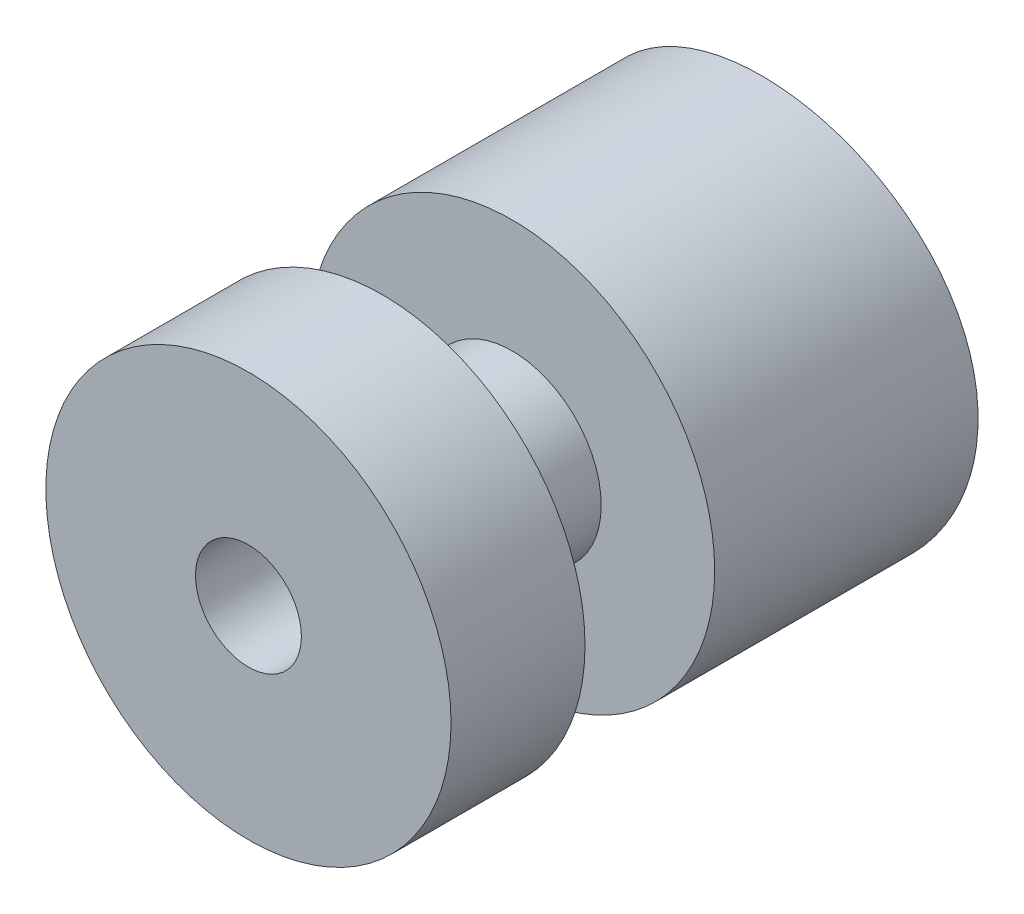
ISO-10303-21;
HEADER;
FILE_DESCRIPTION(('STEP AP214'),'2;1');
FILE_NAME('part.step','',(''),(''),'','','');
FILE_SCHEMA(('AUTOMOTIVE_DESIGN { 1 0 10303 214 1 1 1 1 }'));
ENDSEC;
DATA;
#1=APPLICATION_CONTEXT('core data for automotive mechanical design processes');
#2=APPLICATION_PROTOCOL_DEFINITION('international standard','automotive_design',2000,#1);
#3=PRODUCT_CONTEXT('',#1,'mechanical');
#4=PRODUCT('Part','Part','',(#3));
#5=PRODUCT_RELATED_PRODUCT_CATEGORY('part','',(#4));
#6=PRODUCT_DEFINITION_FORMATION('','',#4);
#7=PRODUCT_DEFINITION_CONTEXT('part definition',#1,'design');
#8=PRODUCT_DEFINITION('design','',#6,#7);
#9=PRODUCT_DEFINITION_SHAPE('','',#8);
#10=(LENGTH_UNIT() NAMED_UNIT(*) SI_UNIT(.MILLI.,.METRE.));
#11=(NAMED_UNIT(*) PLANE_ANGLE_UNIT() SI_UNIT($,.RADIAN.));
#12=(NAMED_UNIT(*) SI_UNIT($,.STERADIAN.) SOLID_ANGLE_UNIT());
#13=UNCERTAINTY_MEASURE_WITH_UNIT(LENGTH_MEASURE(1.E-05),#10,'distance_accuracy_value','');
#14=(GEOMETRIC_REPRESENTATION_CONTEXT(3) GLOBAL_UNCERTAINTY_ASSIGNED_CONTEXT((#13)) GLOBAL_UNIT_ASSIGNED_CONTEXT((#10,
#11,#12)) REPRESENTATION_CONTEXT('',''));
#15=CARTESIAN_POINT('',(0.,0.,0.));
#16=DIRECTION('',(0.,0.,1.));
#17=DIRECTION('',(1.,0.,0.));
#18=AXIS2_PLACEMENT_3D('',#15,#16,#17);
#19=CARTESIAN_POINT('',(0.,0.,24.78278));
#20=DIRECTION('',(0.,0.,-1.));
#21=DIRECTION('',(-1.,0.,0.));
#22=AXIS2_PLACEMENT_3D('',#19,#20,#21);
#23=CYLINDRICAL_SURFACE('',#22,9.525);
#24=CARTESIAN_POINT('',(-9.52499999999997,0.,0.));
#25=CARTESIAN_POINT('',(-9.52500330048903,-0.266266854005192,-1.23946684732187E-06));
#26=CARTESIAN_POINT('',(-9.51383108277555,-0.532486253668478,0.00153994071773551));
#27=CARTESIAN_POINT('',(-9.4692296761848,-1.06310273244726,0.00765771411401945));
#28=CARTESIAN_POINT('',(-9.43579559615122,-1.32749939818876,0.0122349743823788));
#29=CARTESIAN_POINT('',(-9.34687367997087,-1.85272621333056,0.0242999330054013));
#30=CARTESIAN_POINT('',(-9.2913661525161,-2.11355296258781,0.0317902298935893));
#31=CARTESIAN_POINT('',(-9.15871282916754,-2.62955630977296,0.0494644271780228));
#32=CARTESIAN_POINT('',(-9.08156668835782,-2.88473281756699,0.0596483705104002));
#33=CARTESIAN_POINT('',(-8.90627134656277,-3.38744247219539,0.0824087516421784));
#34=CARTESIAN_POINT('',(-8.80813772549415,-3.6349811338019,0.0949834139425969));
#35=CARTESIAN_POINT('',(-8.59154635824059,-4.1208872112801,0.122171539302807));
#36=CARTESIAN_POINT('',(-8.47308835424092,-4.35925451076611,0.13678502822467));
#37=CARTESIAN_POINT('',(-8.2167408639379,-4.82508545874511,0.167631338516709));
#38=CARTESIAN_POINT('',(-8.07885787775121,-5.05255272069676,0.183863617667914));
#39=CARTESIAN_POINT('',(-7.78455604814082,-5.49517682759171,0.217500132751493));
#40=CARTESIAN_POINT('',(-7.62813115682775,-5.71032962175494,0.234904750266664));
#41=CARTESIAN_POINT('',(-7.29691796939915,-6.12797308288935,0.270496229994954));
#42=CARTESIAN_POINT('',(-7.12202888699114,-6.33038349222168,0.288687027618885));
#43=CARTESIAN_POINT('',(-6.75586114837706,-6.71977620665679,0.325243053407821));
#44=CARTESIAN_POINT('',(-6.56458244059568,-6.90675846320622,0.34360828212157));
#45=CARTESIAN_POINT('',(-6.16691824199461,-7.26403510570452,0.380000665686478));
#46=CARTESIAN_POINT('',(-5.96052932874264,-7.43432569046701,0.398027742778209));
#47=CARTESIAN_POINT('',(-5.53418863768815,-7.75692043619742,0.433226659775953));
#48=CARTESIAN_POINT('',(-5.31424162948714,-7.90923086805486,0.450398796641687));
#49=CARTESIAN_POINT('',(-4.86130890845572,-8.19544772125475,0.483480548634538));
#50=CARTESIAN_POINT('',(-4.62827299833442,-8.32927536249283,0.499384644243801));
#51=CARTESIAN_POINT('',(-4.15163613550505,-8.57680921086481,0.529399680025326));
#52=CARTESIAN_POINT('',(-3.90803514591928,-8.69051534775702,0.543510613937834));
#53=CARTESIAN_POINT('',(-3.41200254889603,-8.89696736429672,0.569537472613505));
#54=CARTESIAN_POINT('',(-3.15957124315381,-8.98971395923868,0.581453472281481));
#55=CARTESIAN_POINT('',(-2.64767440125134,-9.15356022227428,0.602751013335538));
#56=CARTESIAN_POINT('',(-2.38820891208658,-9.22466003495164,0.612132571649677));
#57=CARTESIAN_POINT('',(-1.86574302502553,-9.34430320229504,0.628043217917804));
#58=CARTESIAN_POINT('',(-1.602774648083,-9.39298409302451,0.634589683466279));
#59=CARTESIAN_POINT('',(-1.07362022856637,-9.46807129802539,0.644729106316278));
#60=CARTESIAN_POINT('',(-0.807434197968626,-9.49447769517832,0.648322074607516));
#61=CARTESIAN_POINT('',(-0.273771712477415,-9.52481497777159,0.652452417421323));
#62=CARTESIAN_POINT('',(-0.00629531093223397,-9.52874678455103,0.652989917201905));
#63=CARTESIAN_POINT('',(0.52802889360886,-9.51410736257491,0.650994370261949));
#64=CARTESIAN_POINT('',(0.794876698839182,-9.49553621392973,0.648461334472497));
#65=CARTESIAN_POINT('',(1.32425337485495,-9.43623049894585,0.64042359473221));
#66=CARTESIAN_POINT('',(1.58679916508554,-9.39564411755528,0.634938761301743));
#67=CARTESIAN_POINT('',(2.10751270804583,-9.29270946921216,0.621163921901331));
#68=CARTESIAN_POINT('',(2.36568048333808,-9.23036131444696,0.612873930392678));
#69=CARTESIAN_POINT('',(2.87577891027634,-9.08437601446301,0.593721792626814));
#70=CARTESIAN_POINT('',(3.1277106005358,-9.00074244084384,0.582860077914723));
#71=CARTESIAN_POINT('',(3.62371517264379,-8.81275665504933,0.558861541802499));
#72=CARTESIAN_POINT('',(3.86778510900159,-8.70839678010276,0.545723879186261));
#73=CARTESIAN_POINT('',(4.34698837635089,-8.47938949981333,0.517499019204941));
#74=CARTESIAN_POINT('',(4.58209305192908,-8.35468283533033,0.502406154675638));
#75=CARTESIAN_POINT('',(5.04097924885162,-8.08608902897244,0.470721205247798));
#76=CARTESIAN_POINT('',(5.26476044928881,-7.94220134392716,0.454129077897251));
#77=CARTESIAN_POINT('',(5.69946237914339,-7.6362555041895,0.419906498574467));
#78=CARTESIAN_POINT('',(5.91038268868561,-7.47419675674826,0.402276012739385));
#79=CARTESIAN_POINT('',(6.31791065135557,-7.13303918951877,0.366466762636894));
#80=CARTESIAN_POINT('',(6.51451822673205,-6.95394027717518,0.348287995391807));
#81=CARTESIAN_POINT('',(6.89361293120585,-6.57841072058257,0.311738852511899));
#82=CARTESIAN_POINT('',(7.07597186686728,-6.38185067513572,0.293368123066109));
#83=CARTESIAN_POINT('',(7.42349211413347,-5.97404040012362,0.257103280756416));
#84=CARTESIAN_POINT('',(7.58865377302272,-5.76279046735198,0.239209158273271));
#85=CARTESIAN_POINT('',(7.90065119399891,-5.32702159784706,0.204401898209377));
#86=CARTESIAN_POINT('',(8.04748316094256,-5.1024999273475,0.18748896416939));
#87=CARTESIAN_POINT('',(8.32168099513047,-4.64188126603034,0.15513737210968));
#88=CARTESIAN_POINT('',(8.44905413298088,-4.40578864235411,0.139698164259168));
#89=CARTESIAN_POINT('',(8.68356766878404,-3.92342321941065,0.110719266163046));
#90=CARTESIAN_POINT('',(8.79069259643167,-3.67714281003216,0.0971810303374274));
#91=CARTESIAN_POINT('',(8.98380108553784,-3.17631429931234,0.0724099923679377));
#92=CARTESIAN_POINT('',(9.06978461933698,-2.92176618715482,0.0611771932402853));
#93=CARTESIAN_POINT('',(9.21996434291876,-2.40623370943145,0.0413448059967168));
#94=CARTESIAN_POINT('',(9.2841615623795,-2.14524964867087,0.0327450934361336));
#95=CARTESIAN_POINT('',(9.39028808729185,-1.61871505386141,0.0184301915488309));
#96=CARTESIAN_POINT('',(9.43221755180217,-1.35316455244464,0.012714981618106));
#97=CARTESIAN_POINT('',(9.49324288188908,-0.821565776551124,0.00437072985662821));
#98=CARTESIAN_POINT('',(9.51251927852126,-0.555538596540417,0.00171729071043425));
#99=CARTESIAN_POINT('',(9.52870004046934,-0.0227924903889607,-0.000508918703817387));
#100=CARTESIAN_POINT('',(9.52560452474644,0.243926432065953,-8.17053530461407E-05));
#101=CARTESIAN_POINT('',(9.49706542951605,0.776136218567402,0.00384092124911772));
#102=CARTESIAN_POINT('',(9.47162239299174,1.0416271122941,0.00733625995351638));
#103=CARTESIAN_POINT('',(9.39858123422535,1.56948664764881,0.0172936269498104));
#104=CARTESIAN_POINT('',(9.35098312759764,1.83185529147718,0.0237556531508553));
#105=CARTESIAN_POINT('',(9.23423876421166,2.35049195754395,0.0394259292558228));
#106=CARTESIAN_POINT('',(9.16518521354824,2.60678121537523,0.0486223569558603));
#107=CARTESIAN_POINT('',(9.00594489643363,3.11270569655106,0.069512564380267));
#108=CARTESIAN_POINT('',(8.91575040825556,3.36233845141415,0.08120725645701));
#109=CARTESIAN_POINT('',(8.7149137670981,3.85307426982061,0.106757751918281));
#110=CARTESIAN_POINT('',(8.60427497728431,4.09417872854015,0.120613199791825));
#111=CARTESIAN_POINT('',(8.36332847061033,4.56624465805668,0.150096100675029));
#112=CARTESIAN_POINT('',(8.23302016830002,4.79720582668108,0.16572360642538));
#113=CARTESIAN_POINT('',(7.9527822004481,5.24880355081053,0.198414100416893));
#114=CARTESIAN_POINT('',(7.80273506452429,5.46936660913829,0.215485444944596));
#115=CARTESIAN_POINT('',(7.48471426207743,5.89709251789821,0.250496761908543));
#116=CARTESIAN_POINT('',(7.31674053293936,6.10425532152115,0.268436737378671));
#117=CARTESIAN_POINT('',(6.96402745532808,6.50376457319082,0.304682424227914));
#118=CARTESIAN_POINT('',(6.77928722791784,6.69611024351224,0.322988154741446));
#119=CARTESIAN_POINT('',(6.39433028850827,7.06464197178898,0.359451676290284));
#120=CARTESIAN_POINT('',(6.19411387212684,7.24082833827021,0.377609470144078));
#121=CARTESIAN_POINT('',(5.77811986533307,7.57700290773926,0.413395863501652));
#122=CARTESIAN_POINT('',(5.56224267205149,7.73686837985749,0.431019839072264));
#123=CARTESIAN_POINT('',(5.11777897819594,8.0377833614627,0.46509828503979));
#124=CARTESIAN_POINT('',(4.88919718750373,8.17883977883686,0.481553183753399));
#125=CARTESIAN_POINT('',(4.42081376415582,8.44121425482891,0.512837153965773));
#126=CARTESIAN_POINT('',(4.18101022366611,8.5625289412996,0.527665947563614));
#127=CARTESIAN_POINT('',(3.6919133808824,8.78450463556745,0.555273200982717));
#128=CARTESIAN_POINT('',(3.44262012577251,8.88516574604103,0.568051670996811));
#129=CARTESIAN_POINT('',(2.93711265237648,9.06480668823514,0.591158008380648));
#130=CARTESIAN_POINT('',(2.68092261163273,9.14385357639735,0.601493441240519));
#131=CARTESIAN_POINT('',(2.16270232068971,9.28009273037924,0.619471696271575));
#132=CARTESIAN_POINT('',(1.90067207817144,9.33728502494015,0.62711452198384));
#133=CARTESIAN_POINT('',(1.37266733397348,9.42938087748184,0.639489611328413));
#134=CARTESIAN_POINT('',(1.10669301189711,9.46428544721892,0.644222007079986));
#135=CARTESIAN_POINT('',(0.572712408620709,9.51154384779604,0.650641673396777));
#136=CARTESIAN_POINT('',(0.304706139428368,9.52389781179359,0.652328961942837));
#137=CARTESIAN_POINT('',(-0.229217088821527,9.52595274187731,0.652609201576574));
#138=CARTESIAN_POINT('',(-0.495133348478967,9.51583677388594,0.65122715898286));
#139=CARTESIAN_POINT('',(-1.02515426850516,9.47340295712098,0.64545886079122));
#140=CARTESIAN_POINT('',(-1.28925893936102,9.44108523698078,0.641072622599123));
#141=CARTESIAN_POINT('',(-1.81377657559602,9.35449058800991,0.629419143485468));
#142=CARTESIAN_POINT('',(-2.07418955859421,9.30021376401844,0.6221519163186));
#143=CARTESIAN_POINT('',(-2.58948287008729,9.17010457319378,0.604940113323887));
#144=CARTESIAN_POINT('',(-2.84436318621111,9.09427215816753,0.594995531510131));
#145=CARTESIAN_POINT('',(-3.34662844778373,8.92166863380028,0.572714569674256));
#146=CARTESIAN_POINT('',(-3.59401838794789,8.82491184411102,0.560379825963029));
#147=CARTESIAN_POINT('',(-4.07984817245255,8.61109320354978,0.533652740457022));
#148=CARTESIAN_POINT('',(-4.31828487609307,8.49402430687146,0.5192596849864));
#149=CARTESIAN_POINT('',(-4.78443312326207,8.24046179297916,0.48882122269089));
#150=CARTESIAN_POINT('',(-5.01214641918269,8.1039713643466,0.472776087219888));
#151=CARTESIAN_POINT('',(-5.455330125853,7.81251175156655,0.439475641271438));
#152=CARTESIAN_POINT('',(-5.67080043953952,7.65754242094727,0.422220321201989));
#153=CARTESIAN_POINT('',(-6.08968298587766,7.32890258824517,0.386836697317377));
#154=CARTESIAN_POINT('',(-6.2929859727805,7.15509345203714,0.36870255292323));
#155=CARTESIAN_POINT('',(-6.68418747980417,6.79106979052454,0.332204777475231));
#156=CARTESIAN_POINT('',(-6.87209085629858,6.60086047626108,0.313841220889771));
#157=CARTESIAN_POINT('',(-7.23133322647645,6.20522905772375,0.277387971604344));
#158=CARTESIAN_POINT('',(-7.40266552763116,5.99980086569092,0.259298392021937));
#159=CARTESIAN_POINT('',(-7.72747873147153,5.57522547115775,0.22391163256895));
#160=CARTESIAN_POINT('',(-7.88095985511807,5.35607843852009,0.206614442891821));
#161=CARTESIAN_POINT('',(-8.16965548207872,4.90453795662053,0.17322564474784));
#162=CARTESIAN_POINT('',(-8.30478211780241,4.67208787258552,0.157139989126758));
#163=CARTESIAN_POINT('',(-8.55494561534309,4.19651296205124,0.126726757906892));
#164=CARTESIAN_POINT('',(-8.66998279086942,3.95338830231626,0.11239915485607));
#165=CARTESIAN_POINT('',(-8.87902822614219,3.45840718930947,0.0859294034209856));
#166=CARTESIAN_POINT('',(-8.9730561483512,3.20655915739251,0.073785213687748));
#167=CARTESIAN_POINT('',(-9.13949831249253,2.6958023102074,0.0520214742842275));
#168=CARTESIAN_POINT('',(-9.21191754532343,2.43689514046915,0.0424013417015649));
#169=CARTESIAN_POINT('',(-9.35677118831108,1.81935286777272,0.0230005380003648));
#170=CARTESIAN_POINT('',(-9.41978962676029,1.45842984927885,0.0144135024429398));
#171=CARTESIAN_POINT('',(-9.50390156166065,0.731641338005135,0.00291411239068677));
#172=CARTESIAN_POINT('',(-9.52499546605474,0.365775893352001,1.70267942306671E-06));
#173=CARTESIAN_POINT('',(-9.52499999999997,0.,0.));
#174=B_SPLINE_CURVE_WITH_KNOTS('',3,(#24,#25,#26,#27,#28,#29,#30,#31,#32,#33,#34,#35,#36,#37,
#38,#39,#40,#41,#42,#43,#44,#45,#46,#47,#48,#49,#50,#51,#52,#53,#54,#55,#56,#57,#58,#59,#60,#61,
#62,#63,#64,#65,#66,#67,#68,#69,#70,#71,#72,#73,#74,#75,#76,#77,#78,#79,#80,#81,#82,#83,#84,#85,
#86,#87,#88,#89,#90,#91,#92,#93,#94,#95,#96,#97,#98,#99,#100,#101,#102,#103,#104,#105,#106,#107,
#108,#109,#110,#111,#112,#113,#114,#115,#116,#117,#118,#119,#120,#121,#122,#123,#124,#125,#126,
#127,#128,#129,#130,#131,#132,#133,#134,#135,#136,#137,#138,#139,#140,#141,#142,#143,#144,#145,
#146,#147,#148,#149,#150,#151,#152,#153,#154,#155,#156,#157,#158,#159,#160,#161,#162,#163,#164,
#165,#166,#167,#168,#169,#170,#171,#172,#173),.UNSPECIFIED.,.T.,.F.,(4,2,2,2,2,2,2,2,2,2,2,2,2,
2,2,2,2,2,2,2,2,2,2,2,2,2,2,2,2,2,2,2,2,2,2,2,2,2,2,2,2,2,2,2,2,2,2,2,2,2,2,2,2,2,2,2,2,2,2,2,2,
2,2,2,2,2,2,2,2,2,2,2,2,2,4),(0.,0.79848026725783,1.59713602662085,2.39650585583218,
3.1958884275907,3.99467963011361,4.7934809660501,5.5920156338919,6.39081148351263,
7.19421818391016,7.99762741258183,8.80121917823473,9.60452984410413,10.4111652749888,
11.2178035216826,12.0244142357589,12.8310195621825,13.6326083382131,14.4341941315859,
15.2357470639533,16.0372971428059,16.8335177377808,17.6297342281019,18.4258172047833,
19.2221950529778,20.0209351358274,20.8196978422988,21.6184866123815,22.4172797214117,
23.2225854208489,24.0278748546621,24.833330747226,25.6384849489106,26.4442518503012,
27.2500198058754,28.0557496734467,28.8614737856074,29.6607322632564,30.4599864909032,
31.2592212994115,32.0584555446391,32.8542833342385,33.6504022541226,34.4463903258107,
35.2424020942336,36.0433857080199,36.8443721196181,37.6454005449807,38.4464136733044,
39.2530643782303,40.0594180086686,40.8659092306606,41.672396443196,42.4763524466263,
43.2803073927607,44.0842258405837,44.8881395413891,45.6855276781915,46.4829111950937,
47.2802909050978,48.0776723978628,48.8745099176441,49.6716243967982,50.4686081582465,
51.2655982373533,52.0689123274061,52.8719721041208,53.6753548684911,54.4787276875761,
55.2858202443643,56.0929001967762,56.8992216131369,57.7053566512799,58.8022550095971,
59.8991426945903),.UNSPECIFIED.);
#175=CARTESIAN_POINT('',(-9.52499999999997,0.,0.));
#176=VERTEX_POINT('',#175);
#177=EDGE_CURVE('E64',#176,#176,#174,.T.);
#178=ORIENTED_EDGE('',*,*,#177,.T.);
#179=EDGE_LOOP('',(#178));
#180=FACE_BOUND('',#179,.T.);
#181=CARTESIAN_POINT('',(0.,0.,12.38758));
#182=DIRECTION('',(0.,0.,1.));
#183=DIRECTION('',(1.,0.,0.));
#184=AXIS2_PLACEMENT_3D('',#181,#182,#183);
#185=CIRCLE('',#184,9.525);
#186=CARTESIAN_POINT('',(9.525,0.,12.38758));
#187=VERTEX_POINT('',#186);
#188=EDGE_CURVE('E46',#187,#187,#185,.T.);
#189=ORIENTED_EDGE('',*,*,#188,.F.);
#190=EDGE_LOOP('',(#189));
#191=FACE_BOUND('',#190,.T.);
#192=ADVANCED_FACE('F33',(#180,#191),#23,.T.);
#193=CARTESIAN_POINT('',(0.,0.,12.38758));
#194=DIRECTION('',(0.,0.,1.));
#195=DIRECTION('',(1.,0.,0.));
#196=AXIS2_PLACEMENT_3D('',#193,#194,#195);
#197=PLANE('',#196);
#198=CARTESIAN_POINT('',(0.,0.,12.38758));
#199=DIRECTION('',(0.,0.,1.));
#200=DIRECTION('',(1.,0.,0.));
#201=AXIS2_PLACEMENT_3D('',#198,#199,#200);
#202=CIRCLE('',#201,4.191);
#203=CARTESIAN_POINT('',(4.191,0.,12.38758));
#204=VERTEX_POINT('',#203);
#205=EDGE_CURVE('E57',#204,#204,#202,.T.);
#206=ORIENTED_EDGE('',*,*,#205,.F.);
#207=EDGE_LOOP('',(#206));
#208=FACE_BOUND('',#207,.T.);
#209=ORIENTED_EDGE('',*,*,#188,.T.);
#210=EDGE_LOOP('',(#209));
#211=FACE_BOUND('',#210,.T.);
#212=ADVANCED_FACE('F84',(#208,#211),#197,.T.);
#213=CARTESIAN_POINT('',(0.,0.,18.48358));
#214=DIRECTION('',(0.,0.,1.));
#215=DIRECTION('',(1.,0.,0.));
#216=AXIS2_PLACEMENT_3D('',#213,#214,#215);
#217=PLANE('',#216);
#218=CARTESIAN_POINT('',(0.,0.,18.48358));
#219=DIRECTION('',(0.,0.,1.));
#220=DIRECTION('',(1.,0.,0.));
#221=AXIS2_PLACEMENT_3D('',#218,#219,#220);
#222=CIRCLE('',#221,4.191);
#223=CARTESIAN_POINT('',(4.191,0.,18.48358));
#224=VERTEX_POINT('',#223);
#225=EDGE_CURVE('E54',#224,#224,#222,.T.);
#226=ORIENTED_EDGE('',*,*,#225,.T.);
#227=EDGE_LOOP('',(#226));
#228=FACE_BOUND('',#227,.T.);
#229=CARTESIAN_POINT('',(0.,0.,18.48358));
#230=DIRECTION('',(0.,0.,1.));
#231=DIRECTION('',(1.,0.,0.));
#232=AXIS2_PLACEMENT_3D('',#229,#230,#231);
#233=CIRCLE('',#232,9.525);
#234=CARTESIAN_POINT('',(9.525,0.,18.48358));
#235=VERTEX_POINT('',#234);
#236=EDGE_CURVE('E51',#235,#235,#233,.T.);
#237=ORIENTED_EDGE('',*,*,#236,.F.);
#238=EDGE_LOOP('',(#237));
#239=FACE_BOUND('',#238,.T.);
#240=ADVANCED_FACE('F83',(#228,#239),#217,.F.);
#241=CARTESIAN_POINT('',(0.,0.,12.38758));
#242=DIRECTION('',(0.,0.,1.));
#243=DIRECTION('',(1.,0.,0.));
#244=AXIS2_PLACEMENT_3D('',#241,#242,#243);
#245=CYLINDRICAL_SURFACE('',#244,4.191);
#246=CARTESIAN_POINT('',(4.191,0.,12.38758));
#247=CARTESIAN_POINT('',(4.191,0.,12.45108));
#248=CARTESIAN_POINT('',(4.191,0.,12.51458));
#249=CARTESIAN_POINT('',(4.191,0.,12.64158));
#250=CARTESIAN_POINT('',(4.191,0.,12.70508));
#251=CARTESIAN_POINT('',(4.191,0.,12.83208));
#252=CARTESIAN_POINT('',(4.191,0.,12.89558));
#253=CARTESIAN_POINT('',(4.191,0.,13.02258));
#254=CARTESIAN_POINT('',(4.191,0.,13.08608));
#255=CARTESIAN_POINT('',(4.191,0.,13.21308));
#256=CARTESIAN_POINT('',(4.191,0.,13.27658));
#257=CARTESIAN_POINT('',(4.191,0.,13.40358));
#258=CARTESIAN_POINT('',(4.191,0.,13.46708));
#259=CARTESIAN_POINT('',(4.191,0.,13.59408));
#260=CARTESIAN_POINT('',(4.191,0.,13.65758));
#261=CARTESIAN_POINT('',(4.191,0.,13.78458));
#262=CARTESIAN_POINT('',(4.191,0.,13.84808));
#263=CARTESIAN_POINT('',(4.191,0.,13.97508));
#264=CARTESIAN_POINT('',(4.191,0.,14.03858));
#265=CARTESIAN_POINT('',(4.191,0.,14.16558));
#266=CARTESIAN_POINT('',(4.191,0.,14.22908));
#267=CARTESIAN_POINT('',(4.191,0.,14.35608));
#268=CARTESIAN_POINT('',(4.191,0.,14.41958));
#269=CARTESIAN_POINT('',(4.191,0.,14.54658));
#270=CARTESIAN_POINT('',(4.191,0.,14.61008));
#271=CARTESIAN_POINT('',(4.191,0.,14.73708));
#272=CARTESIAN_POINT('',(4.191,0.,14.80058));
#273=CARTESIAN_POINT('',(4.191,0.,14.92758));
#274=CARTESIAN_POINT('',(4.191,0.,14.99108));
#275=CARTESIAN_POINT('',(4.191,0.,15.11808));
#276=CARTESIAN_POINT('',(4.191,0.,15.18158));
#277=CARTESIAN_POINT('',(4.191,0.,15.30858));
#278=CARTESIAN_POINT('',(4.191,0.,15.37208));
#279=CARTESIAN_POINT('',(4.191,0.,15.49908));
#280=CARTESIAN_POINT('',(4.191,0.,15.56258));
#281=CARTESIAN_POINT('',(4.191,0.,15.68958));
#282=CARTESIAN_POINT('',(4.191,0.,15.75308));
#283=CARTESIAN_POINT('',(4.191,0.,15.88008));
#284=CARTESIAN_POINT('',(4.191,0.,15.94358));
#285=CARTESIAN_POINT('',(4.191,0.,16.07058));
#286=CARTESIAN_POINT('',(4.191,0.,16.13408));
#287=CARTESIAN_POINT('',(4.191,0.,16.26108));
#288=CARTESIAN_POINT('',(4.191,0.,16.32458));
#289=CARTESIAN_POINT('',(4.191,0.,16.45158));
#290=CARTESIAN_POINT('',(4.191,0.,16.51508));
#291=CARTESIAN_POINT('',(4.191,0.,16.64208));
#292=CARTESIAN_POINT('',(4.191,0.,16.70558));
#293=CARTESIAN_POINT('',(4.191,0.,16.83258));
#294=CARTESIAN_POINT('',(4.191,0.,16.89608));
#295=CARTESIAN_POINT('',(4.191,0.,17.02308));
#296=CARTESIAN_POINT('',(4.191,0.,17.08658));
#297=CARTESIAN_POINT('',(4.191,0.,17.21358));
#298=CARTESIAN_POINT('',(4.191,0.,17.27708));
#299=CARTESIAN_POINT('',(4.191,0.,17.40408));
#300=CARTESIAN_POINT('',(4.191,0.,17.46758));
#301=CARTESIAN_POINT('',(4.191,0.,17.59458));
#302=CARTESIAN_POINT('',(4.191,0.,17.65808));
#303=CARTESIAN_POINT('',(4.191,0.,17.78508));
#304=CARTESIAN_POINT('',(4.191,0.,17.84858));
#305=CARTESIAN_POINT('',(4.191,0.,17.97558));
#306=CARTESIAN_POINT('',(4.191,0.,18.03908));
#307=CARTESIAN_POINT('',(4.191,0.,18.16608));
#308=CARTESIAN_POINT('',(4.191,0.,18.22958));
#309=CARTESIAN_POINT('',(4.191,0.,18.35658));
#310=CARTESIAN_POINT('',(4.191,0.,18.42008));
#311=CARTESIAN_POINT('',(4.191,0.,18.48358));
#312=B_SPLINE_CURVE_WITH_KNOTS('',3,(#246,#247,#248,#249,#250,#251,#252,#253,#254,#255,#256,
#257,#258,#259,#260,#261,#262,#263,#264,#265,#266,#267,#268,#269,#270,#271,#272,#273,#274,#275,
#276,#277,#278,#279,#280,#281,#282,#283,#284,#285,#286,#287,#288,#289,#290,#291,#292,#293,#294,
#295,#296,#297,#298,#299,#300,#301,#302,#303,#304,#305,#306,#307,#308,#309,#310,#311),
.UNSPECIFIED.,.F.,.F.,(4,2,2,2,2,2,2,2,2,2,2,2,2,2,2,2,2,2,2,2,2,2,2,2,2,2,2,2,2,2,2,2,4),(0.,
0.190500000000001,0.381000000000001,0.571500000000001,0.762000000000001,0.9525,1.143,1.3335,
1.524,1.7145,1.905,2.0955,2.286,2.4765,2.667,2.8575,3.048,3.2385,3.429,3.6195,3.81,4.0005,4.191,
4.3815,4.572,4.7625,4.953,5.1435,5.334,5.5245,5.715,5.9055,6.096),.UNSPECIFIED.);
#313=EDGE_CURVE('BSEAM78',#204,#224,#312,.T.);
#314=ORIENTED_EDGE('',*,*,#205,.T.);
#315=ORIENTED_EDGE('',*,*,#225,.F.);
#316=ORIENTED_EDGE('',*,*,#313,.T.);
#317=ORIENTED_EDGE('',*,*,#313,.F.);
#318=EDGE_LOOP('',(#314,#316,#315,#317));
#319=FACE_BOUND('',#318,.T.);
#320=ADVANCED_FACE('F78',(#319),#245,.T.);
#321=CARTESIAN_POINT('',(0.,0.,24.78278));
#322=DIRECTION('',(0.,0.,1.));
#323=DIRECTION('',(1.,0.,0.));
#324=AXIS2_PLACEMENT_3D('',#321,#322,#323);
#325=PLANE('',#324);
#326=CARTESIAN_POINT('',(0.,0.,24.78278));
#327=DIRECTION('',(0.,0.,1.));
#328=DIRECTION('',(1.,0.,0.));
#329=AXIS2_PLACEMENT_3D('',#326,#327,#328);
#330=CIRCLE('',#329,2.48919999999999);
#331=CARTESIAN_POINT('',(2.48919999999999,0.,24.78278));
#332=VERTEX_POINT('',#331);
#333=EDGE_CURVE('E70',#332,#332,#330,.T.);
#334=ORIENTED_EDGE('',*,*,#333,.F.);
#335=EDGE_LOOP('',(#334));
#336=FACE_BOUND('',#335,.T.);
#337=CARTESIAN_POINT('',(0.,0.,24.78278));
#338=DIRECTION('',(0.,0.,1.));
#339=DIRECTION('',(1.,0.,0.));
#340=AXIS2_PLACEMENT_3D('',#337,#338,#339);
#341=CIRCLE('',#340,9.525);
#342=CARTESIAN_POINT('',(9.525,0.,24.78278));
#343=VERTEX_POINT('',#342);
#344=EDGE_CURVE('E11',#343,#343,#341,.T.);
#345=ORIENTED_EDGE('',*,*,#344,.T.);
#346=EDGE_LOOP('',(#345));
#347=FACE_BOUND('',#346,.T.);
#348=ADVANCED_FACE('F82',(#336,#347),#325,.T.);
#349=ORIENTED_EDGE('',*,*,#236,.T.);
#350=EDGE_LOOP('',(#349));
#351=FACE_BOUND('',#350,.T.);
#352=ORIENTED_EDGE('',*,*,#344,.F.);
#353=EDGE_LOOP('',(#352));
#354=FACE_BOUND('',#353,.T.);
#355=ADVANCED_FACE('F35',(#351,#354),#23,.T.);
#356=CARTESIAN_POINT('',(0.,45.7573625313525,-69.1975207287082));
#357=DIRECTION('',(0.,-1.,0.));
#358=DIRECTION('',(0.,0.,-1.));
#359=AXIS2_PLACEMENT_3D('',#356,#357,#358);
#360=CYLINDRICAL_SURFACE('',#359,69.85);
#361=CARTESIAN_POINT('',(2.48919999999999,0.,0.608112162628016));
#362=CARTESIAN_POINT('',(2.48919381632929,0.139771819697327,0.608112760668084));
#363=CARTESIAN_POINT('',(2.4773879240462,0.279643857264816,0.608536470363282));
#364=CARTESIAN_POINT('',(2.43045753643,0.555532515618023,0.610185910429983));
#365=CARTESIAN_POINT('',(2.39530527447313,0.691544344233717,0.611412595782444));
#366=CARTESIAN_POINT('',(2.30268705465171,0.955675935165823,0.614528854411066));
#367=CARTESIAN_POINT('',(2.24523211893721,1.08379955971024,0.616418100200391));
#368=CARTESIAN_POINT('',(2.10965555770892,1.32854782061108,0.620646182206453));
#369=CARTESIAN_POINT('',(2.0315389385839,1.44517523315047,0.622984909474982));
#370=CARTESIAN_POINT('',(1.85680395903708,1.66372426254721,0.627850011501955));
#371=CARTESIAN_POINT('',(1.76017634138182,1.76563847651856,0.630376479759886));
#372=CARTESIAN_POINT('',(1.55117936585739,1.95180552981073,0.63533146435531));
#373=CARTESIAN_POINT('',(1.4388093778114,2.03605766177027,0.637759976766555));
#374=CARTESIAN_POINT('',(1.20148546575743,2.18452401616452,0.642245883257675));
#375=CARTESIAN_POINT('',(1.0765284333431,2.24873327282865,0.644303185314249));
#376=CARTESIAN_POINT('',(0.817599549175853,2.35525909747777,0.647813962453287));
#377=CARTESIAN_POINT('',(0.683627740975659,2.39757577122295,0.649267440452738));
#378=CARTESIAN_POINT('',(0.410533046297792,2.45909785742453,0.65140618381721));
#379=CARTESIAN_POINT('',(0.271412391053553,2.4783131626465,0.652091778006719));
#380=CARTESIAN_POINT('',(-0.00808149071102065,2.49311755666619,0.652618578375902));
#381=CARTESIAN_POINT('',(-0.148454711106434,2.48870676093009,0.652459788682274));
#382=CARTESIAN_POINT('',(-0.426402043294107,2.45639245706819,0.651315999111863));
#383=CARTESIAN_POINT('',(-0.563977396976728,2.42849961579114,0.650331374375962));
#384=CARTESIAN_POINT('',(-0.832491709628483,2.35002950877194,0.647647301773017));
#385=CARTESIAN_POINT('',(-0.963430650928736,2.2994521826378,0.645947852002924));
#386=CARTESIAN_POINT('',(-1.21498961021943,2.17703658947792,0.642024995023709));
#387=CARTESIAN_POINT('',(-1.33560725057798,2.10519344052784,0.639801467527709));
#388=CARTESIAN_POINT('',(-1.56307366740624,1.94228917162937,0.635080999091019));
#389=CARTESIAN_POINT('',(-1.6699223971909,1.85122798652278,0.632584057223339));
#390=CARTESIAN_POINT('',(-1.86688013431696,1.65241218037,0.627596471086448));
#391=CARTESIAN_POINT('',(-1.95697980047695,1.54464830507244,0.625105831091062));
#392=CARTESIAN_POINT('',(-2.11780988505574,1.31551874925783,0.620413040640562));
#393=CARTESIAN_POINT('',(-2.18854029992275,1.19415306624658,0.618210890238347));
#394=CARTESIAN_POINT('',(-2.30862313462819,0.941259681429859,0.614343495872845));
#395=CARTESIAN_POINT('',(-2.35797524038091,0.809731830357358,0.612678259797882));
#396=CARTESIAN_POINT('',(-2.4338944648716,0.540250127997777,0.610072790603329));
#397=CARTESIAN_POINT('',(-2.46046167092316,0.402296301337697,0.609132554705479));
#398=CARTESIAN_POINT('',(-2.4900454668837,0.123959952208416,0.608083612605218));
#399=CARTESIAN_POINT('',(-2.49307500377759,-0.0164211925076104,0.60797444926883));
#400=CARTESIAN_POINT('',(-2.47553121417359,-0.29569867378869,0.608598768747401));
#401=CARTESIAN_POINT('',(-2.45495792672948,-0.434595012810153,0.6093322501681));
#402=CARTESIAN_POINT('',(-2.39080321586281,-0.706923935855779,0.611558760578068));
#403=CARTESIAN_POINT('',(-2.34722768597867,-0.840357909992195,0.613051595005522));
#404=CARTESIAN_POINT('',(-2.23831141344014,-1.09801711246913,0.616628366074917));
#405=CARTESIAN_POINT('',(-2.17297060791323,-1.22224231420735,0.618712304424355));
#406=CARTESIAN_POINT('',(-2.02234523455279,-1.45801728995438,0.623237486768462));
#407=CARTESIAN_POINT('',(-1.93705195191422,-1.56956149345459,0.625678886719715));
#408=CARTESIAN_POINT('',(-1.74895556952275,-1.77675216666616,0.630643231619059));
#409=CARTESIAN_POINT('',(-1.64615240957019,-1.87239858171805,0.633166176847481));
#410=CARTESIAN_POINT('',(-1.42589899077031,-2.04512190418865,0.638010543845812));
#411=CARTESIAN_POINT('',(-1.30844218026583,-2.12219045995446,0.640331874681377));
#412=CARTESIAN_POINT('',(-1.0622489685257,-2.25551328025477,0.644510056612977));
#413=CARTESIAN_POINT('',(-0.933512598211345,-2.31176760184628,0.646366908982258));
#414=CARTESIAN_POINT('',(-0.668446011613132,-2.40185045369991,0.649406394703006));
#415=CARTESIAN_POINT('',(-0.532117630601891,-2.43568437851872,0.650589190229243));
#416=CARTESIAN_POINT('',(-0.255710974229564,-2.47998369910915,0.652147881900899));
#417=CARTESIAN_POINT('',(-0.115632706282427,-2.49044914107945,0.652523779641528));
#418=CARTESIAN_POINT('',(0.164214135641154,-2.48771381433353,0.652426315733464));
#419=CARTESIAN_POINT('',(0.303982838398372,-2.47452618454105,0.65195342557351));
#420=CARTESIAN_POINT('',(0.579320931207139,-2.42488612823694,0.650212585346656));
#421=CARTESIAN_POINT('',(0.71489031302002,-2.38843365608495,0.648944633720024));
#422=CARTESIAN_POINT('',(0.977985547562657,-2.29330083880758,0.64575645040141));
#423=CARTESIAN_POINT('',(1.10551127791633,-2.23462015559738,0.643836208788327));
#424=CARTESIAN_POINT('',(1.34889921682781,-2.09670016081047,0.639559714560801));
#425=CARTESIAN_POINT('',(1.46476183219631,-2.01746156664099,0.63720347716208));
#426=CARTESIAN_POINT('',(1.6815973900349,-1.84063254956705,0.632319016581496));
#427=CARTESIAN_POINT('',(1.78256363089848,-1.74303391146237,0.629790716734775));
#428=CARTESIAN_POINT('',(1.96670662996222,-1.53224303418076,0.6248472831452));
#429=CARTESIAN_POINT('',(2.0498789836598,-1.41904694555641,0.622432177536461));
#430=CARTESIAN_POINT('',(2.19609308253213,-1.18021983486051,0.617986479023467));
#431=CARTESIAN_POINT('',(2.25912029811557,-1.05457992290125,0.615956164075438));
#432=CARTESIAN_POINT('',(2.36311234523,-0.794590709873858,0.612513885308932));
#433=CARTESIAN_POINT('',(2.4041034280351,-0.66025198637451,0.611101186111734));
#434=CARTESIAN_POINT('',(2.45202219776184,-0.43755653294147,0.609430246049661));
#435=CARTESIAN_POINT('',(2.46594627198999,-0.350644604612291,0.608938119665041));
#436=CARTESIAN_POINT('',(2.48453711638804,-0.175835006952112,0.608278889894341));
#437=CARTESIAN_POINT('',(2.48920389045188,-0.0879373380357635,0.608111786371545));
#438=CARTESIAN_POINT('',(2.48919999999999,0.,0.608112162628016));
#439=B_SPLINE_CURVE_WITH_KNOTS('',3,(#361,#362,#363,#364,#365,#366,#367,#368,#369,#370,#371,
#372,#373,#374,#375,#376,#377,#378,#379,#380,#381,#382,#383,#384,#385,#386,#387,#388,#389,#390,
#391,#392,#393,#394,#395,#396,#397,#398,#399,#400,#401,#402,#403,#404,#405,#406,#407,#408,#409,
#410,#411,#412,#413,#414,#415,#416,#417,#418,#419,#420,#421,#422,#423,#424,#425,#426,#427,#428,
#429,#430,#431,#432,#433,#434,#435,#436,#437,#438),.UNSPECIFIED.,.T.,.F.,(4,2,2,2,2,2,2,2,2,2,2,
2,2,2,2,2,2,2,2,2,2,2,2,2,2,2,2,2,2,2,2,2,2,2,2,2,2,2,4),(0.,0.418994471208977,
0.838488161174567,1.2577747975914,1.67695993250188,2.09635524909262,2.51576735913728,
2.93528329930819,3.35479721283386,3.77413141264456,4.19346356307448,4.61260533227855,
5.0317482173532,5.45098739839157,5.87022800087101,6.28970172263521,6.70917552131928,
7.12865548261658,7.54813383642526,7.96738143821482,8.38662834630872,8.8057678888129,
9.22490864207999,9.6442328098025,10.0635584192076,10.4830721858168,10.9025848024256,
11.3219964436979,11.7414072558075,12.1605851637021,12.5797638939316,12.9989490000075,
13.4181194797925,13.8374779654264,14.2569401346403,14.6767041599492,15.0959670130379,
15.3595771887369,15.6231872535526),.UNSPECIFIED.);
#440=CARTESIAN_POINT('',(2.48919999999999,0.,0.608112162628016));
#441=VERTEX_POINT('',#440);
#442=EDGE_CURVE('E38',#441,#441,#439,.T.);
#443=ORIENTED_EDGE('',*,*,#442,.T.);
#444=EDGE_LOOP('',(#443));
#445=FACE_BOUND('',#444,.T.);
#446=ORIENTED_EDGE('',*,*,#177,.F.);
#447=EDGE_LOOP('',(#446));
#448=FACE_BOUND('',#447,.T.);
#449=ADVANCED_FACE('F71',(#445,#448),#360,.F.);
#450=CARTESIAN_POINT('',(0.,0.,24.78278));
#451=DIRECTION('',(0.,0.,1.));
#452=DIRECTION('',(1.,0.,0.));
#453=AXIS2_PLACEMENT_3D('',#450,#451,#452);
#454=CYLINDRICAL_SURFACE('',#453,2.48919999999999);
#455=ORIENTED_EDGE('',*,*,#333,.T.);
#456=EDGE_LOOP('',(#455));
#457=FACE_BOUND('',#456,.T.);
#458=ORIENTED_EDGE('',*,*,#442,.F.);
#459=EDGE_LOOP('',(#458));
#460=FACE_BOUND('',#459,.T.);
#461=ADVANCED_FACE('F75',(#457,#460),#454,.F.);
#462=CLOSED_SHELL('',(#192,#212,#240,#320,#348,#355,#449,#461));
#463=MANIFOLD_SOLID_BREP('B2',#462);
#464=ADVANCED_BREP_SHAPE_REPRESENTATION('',(#18,#463),#14);
#465=SHAPE_DEFINITION_REPRESENTATION(#9,#464);
ENDSEC;
END-ISO-10303-21;
